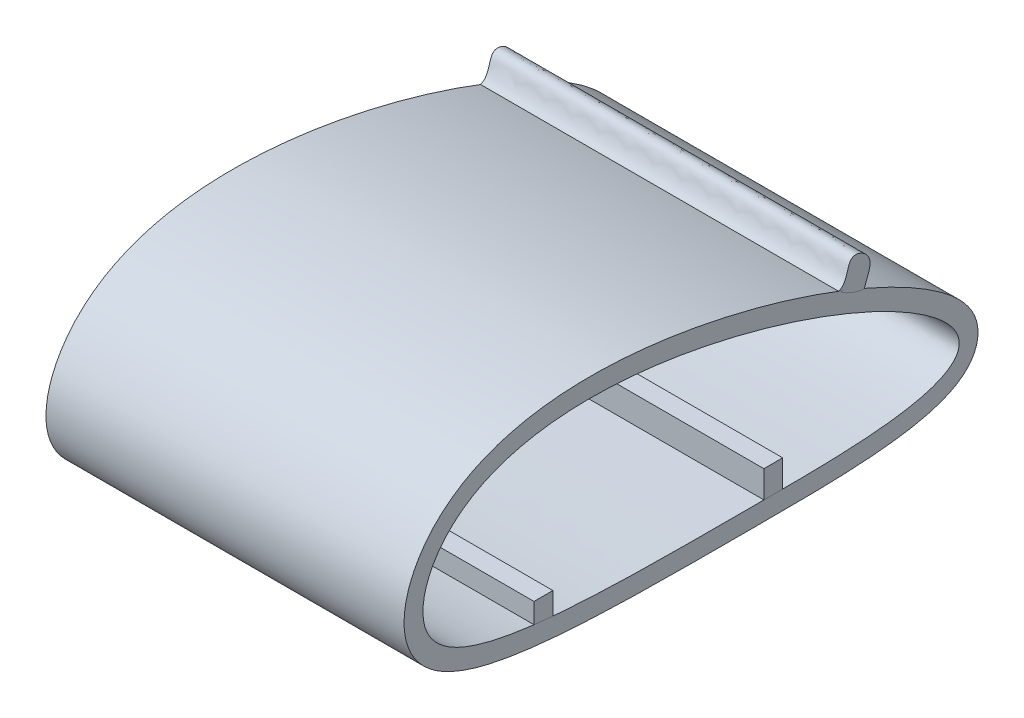
ISO-10303-21;
HEADER;
FILE_DESCRIPTION(('STEP AP214'),'2;1');
FILE_NAME('part.step','',(''),(''),'','','');
FILE_SCHEMA(('AUTOMOTIVE_DESIGN { 1 0 10303 214 1 1 1 1 }'));
ENDSEC;
DATA;
#1=APPLICATION_CONTEXT('core data for automotive mechanical design processes');
#2=APPLICATION_PROTOCOL_DEFINITION('international standard','automotive_design',2000,#1);
#3=PRODUCT_CONTEXT('',#1,'mechanical');
#4=PRODUCT('Part','Part','',(#3));
#5=PRODUCT_RELATED_PRODUCT_CATEGORY('part','',(#4));
#6=PRODUCT_DEFINITION_FORMATION('','',#4);
#7=PRODUCT_DEFINITION_CONTEXT('part definition',#1,'design');
#8=PRODUCT_DEFINITION('design','',#6,#7);
#9=PRODUCT_DEFINITION_SHAPE('','',#8);
#10=(LENGTH_UNIT() NAMED_UNIT(*) SI_UNIT(.MILLI.,.METRE.));
#11=(NAMED_UNIT(*) PLANE_ANGLE_UNIT() SI_UNIT($,.RADIAN.));
#12=(NAMED_UNIT(*) SI_UNIT($,.STERADIAN.) SOLID_ANGLE_UNIT());
#13=UNCERTAINTY_MEASURE_WITH_UNIT(LENGTH_MEASURE(1.E-05),#10,'distance_accuracy_value','');
#14=(GEOMETRIC_REPRESENTATION_CONTEXT(3) GLOBAL_UNCERTAINTY_ASSIGNED_CONTEXT((#13)) GLOBAL_UNIT_ASSIGNED_CONTEXT((#10,
#11,#12)) REPRESENTATION_CONTEXT('',''));
#15=CARTESIAN_POINT('',(0.,0.,0.));
#16=DIRECTION('',(0.,0.,1.));
#17=DIRECTION('',(1.,0.,0.));
#18=AXIS2_PLACEMENT_3D('',#15,#16,#17);
#19=CARTESIAN_POINT('',(0.,38.0482697428457,-22.7803230976267));
#20=CARTESIAN_POINT('',(0.,36.9546355091509,-24.1162425999965));
#21=CARTESIAN_POINT('',(0.,35.9717595566556,-25.6799088880573));
#22=CARTESIAN_POINT('',(0.,35.1229121431369,-28.3604796675899));
#23=CARTESIAN_POINT('',(0.,35.2827771145835,-29.6059542996546));
#24=B_SPLINE_CURVE_WITH_KNOTS('',4,(#19,#20,#21,#22,#23),.UNSPECIFIED.,.F.,.F.,(5,5),(0.,1.),.UNSPECIFIED.);
#25=DIRECTION('',(1.,0.,0.));
#26=VECTOR('',#25,1.);
#27=SURFACE_OF_LINEAR_EXTRUSION('',#24,#26);
#28=CARTESIAN_POINT('',(95.,38.0482697428457,-22.7803230976267));
#29=CARTESIAN_POINT('',(95.,36.9546355091509,-24.1162425999965));
#30=CARTESIAN_POINT('',(95.,35.9717595566556,-25.6799088880573));
#31=CARTESIAN_POINT('',(95.,35.1229121431369,-28.3604796675899));
#32=CARTESIAN_POINT('',(95.,35.2827771145835,-29.6059542996546));
#33=B_SPLINE_CURVE_WITH_KNOTS('',4,(#28,#29,#30,#31,#32),.UNSPECIFIED.,.F.,.F.,(5,5),(0.,1.),.UNSPECIFIED.);
#34=CARTESIAN_POINT('',(95.,38.0482697428457,-22.7803230976267));
#35=VERTEX_POINT('',#34);
#36=CARTESIAN_POINT('',(95.,35.2827771145835,-29.6059542996546));
#37=VERTEX_POINT('',#36);
#38=EDGE_CURVE('E76',#35,#37,#33,.T.);
#39=ORIENTED_EDGE('',*,*,#38,.F.);
#40=DIRECTION('',(1.,0.,0.));
#41=VECTOR('',#40,1.);
#42=CARTESIAN_POINT('',(0.,38.0482697428457,-22.7803230976267));
#43=LINE('',#42,#41);
#44=CARTESIAN_POINT('',(0.,38.0482697428457,-22.7803230976267));
#45=VERTEX_POINT('',#44);
#46=EDGE_CURVE('E12',#45,#35,#43,.T.);
#47=ORIENTED_EDGE('',*,*,#46,.F.);
#48=CARTESIAN_POINT('',(0.,35.2827771145835,-29.6059542996546));
#49=VERTEX_POINT('',#48);
#50=EDGE_CURVE('E80',#45,#49,#24,.T.);
#51=ORIENTED_EDGE('',*,*,#50,.T.);
#52=DIRECTION('',(1.,0.,0.));
#53=VECTOR('',#52,1.);
#54=CARTESIAN_POINT('',(0.,35.2827771145835,-29.6059542996546));
#55=LINE('',#54,#53);
#56=EDGE_CURVE('E50',#49,#37,#55,.T.);
#57=ORIENTED_EDGE('',*,*,#56,.T.);
#58=EDGE_LOOP('',(#39,#47,#51,#57));
#59=FACE_BOUND('',#58,.T.);
#60=ADVANCED_FACE('F46',(#59),#27,.T.);
#61=CARTESIAN_POINT('',(0.,35.2827771145835,-29.6059542996546));
#62=CARTESIAN_POINT('',(0.,38.9961838760519,-30.9938729019657));
#63=CARTESIAN_POINT('',(0.,40.4102287169724,-31.7693168469867));
#64=CARTESIAN_POINT('',(0.,42.0675500896643,-32.0125933787579));
#65=CARTESIAN_POINT('',(0.,43.4815949305848,-30.6593676707802));
#66=CARTESIAN_POINT('',(0.,44.6219536732627,-28.8195888992599));
#67=CARTESIAN_POINT('',(0.,45.534240667405,-26.6605096797898));
#68=CARTESIAN_POINT('',(0.,45.1085067368053,-24.9119596076837));
#69=CARTESIAN_POINT('',(0.,43.8921240779489,-25.565765286819));
#70=CARTESIAN_POINT('',(0.,42.0523453064286,-25.565765286819));
#71=CARTESIAN_POINT('',(0.,40.3190000175582,-25.0944170065122));
#72=CARTESIAN_POINT('',(0.,39.1634364916446,-24.5014304603197));
#73=CARTESIAN_POINT('',(0.,38.4031973298594,-23.9388534805986));
#74=CARTESIAN_POINT('',(0.,38.0482697428457,-22.7803230976267));
#75=B_SPLINE_CURVE_WITH_KNOTS('',13,(#61,#62,#63,#64,#65,#66,#67,#68,#69,#70,#71,#72,#73,#74),
.UNSPECIFIED.,.F.,.F.,(14,14),(0.,1.),.UNSPECIFIED.);
#76=DIRECTION('',(1.,0.,0.));
#77=VECTOR('',#76,1.);
#78=SURFACE_OF_LINEAR_EXTRUSION('',#75,#77);
#79=CARTESIAN_POINT('',(95.,35.2827771145835,-29.6059542996546));
#80=CARTESIAN_POINT('',(95.,38.9961838760519,-30.9938729019657));
#81=CARTESIAN_POINT('',(95.,40.4102287169724,-31.7693168469867));
#82=CARTESIAN_POINT('',(95.,42.0675500896643,-32.0125933787579));
#83=CARTESIAN_POINT('',(95.,43.4815949305848,-30.6593676707802));
#84=CARTESIAN_POINT('',(95.,44.6219536732627,-28.8195888992599));
#85=CARTESIAN_POINT('',(95.,45.534240667405,-26.6605096797898));
#86=CARTESIAN_POINT('',(95.,45.1085067368053,-24.9119596076837));
#87=CARTESIAN_POINT('',(95.,43.8921240779489,-25.565765286819));
#88=CARTESIAN_POINT('',(95.,42.0523453064286,-25.565765286819));
#89=CARTESIAN_POINT('',(95.,40.3190000175582,-25.0944170065122));
#90=CARTESIAN_POINT('',(95.,39.1634364916446,-24.5014304603197));
#91=CARTESIAN_POINT('',(95.,38.4031973298594,-23.9388534805986));
#92=CARTESIAN_POINT('',(95.,38.0482697428457,-22.7803230976267));
#93=B_SPLINE_CURVE_WITH_KNOTS('',13,(#79,#80,#81,#82,#83,#84,#85,#86,#87,#88,#89,#90,#91,#92),
.UNSPECIFIED.,.F.,.F.,(14,14),(0.,1.),.UNSPECIFIED.);
#94=EDGE_CURVE('E73',#37,#35,#93,.T.);
#95=ORIENTED_EDGE('',*,*,#94,.F.);
#96=ORIENTED_EDGE('',*,*,#56,.F.);
#97=EDGE_CURVE('E75',#49,#45,#75,.T.);
#98=ORIENTED_EDGE('',*,*,#97,.T.);
#99=ORIENTED_EDGE('',*,*,#46,.T.);
#100=EDGE_LOOP('',(#95,#96,#98,#99));
#101=FACE_BOUND('',#100,.T.);
#102=ADVANCED_FACE('F71',(#101),#78,.T.);
#103=CARTESIAN_POINT('',(0.,36.0919871754071,-26.0232887372482));
#104=DIRECTION('',(1.,0.,0.));
#105=DIRECTION('',(0.,0.,-1.));
#106=AXIS2_PLACEMENT_3D('',#103,#104,#105);
#107=PLANE('',#106);
#108=ORIENTED_EDGE('',*,*,#50,.F.);
#109=ORIENTED_EDGE('',*,*,#97,.F.);
#110=EDGE_LOOP('',(#108,#109));
#111=FACE_BOUND('',#110,.T.);
#112=ADVANCED_FACE('F104',(#111),#107,.F.);
#113=CARTESIAN_POINT('',(95.,36.0919871754071,-26.0232887372482));
#114=DIRECTION('',(1.,0.,0.));
#115=DIRECTION('',(0.,0.,-1.));
#116=AXIS2_PLACEMENT_3D('',#113,#114,#115);
#117=PLANE('',#116);
#118=ORIENTED_EDGE('',*,*,#38,.T.);
#119=ORIENTED_EDGE('',*,*,#94,.T.);
#120=EDGE_LOOP('',(#118,#119));
#121=FACE_BOUND('',#120,.T.);
#122=ADVANCED_FACE('F79',(#121),#117,.T.);
#123=CLOSED_SHELL('',(#60,#102,#112,#122));
#124=MANIFOLD_SOLID_BREP('B2',#123);
#125=CARTESIAN_POINT('',(0.,-6.28236919455739E-05,-2.96498298416057));
#126=DIRECTION('',(0.,-0.999998722552505,-0.00159840337801903));
#127=DIRECTION('',(0.,0.00159840337801903,-0.999998722552505));
#128=AXIS2_PLACEMENT_3D('',#125,#126,#127);
#129=PLANE('',#128);
#130=DIRECTION('',(0.,0.00159840337801903,-0.999998722552505));
#131=VECTOR('',#130,1.);
#132=CARTESIAN_POINT('',(95.,-6.28236919455739E-05,-2.96498298416057));
#133=LINE('',#132,#131);
#134=CARTESIAN_POINT('',(95.,-6.28236919455739E-05,-2.96498298416057));
#135=VERTEX_POINT('',#134);
#136=CARTESIAN_POINT('',(95.,0.00790631647110169,-7.95066437878173));
#137=VERTEX_POINT('',#136);
#138=EDGE_CURVE('E214',#135,#137,#133,.T.);
#139=ORIENTED_EDGE('',*,*,#138,.F.);
#140=DIRECTION('',(1.,0.,0.));
#141=VECTOR('',#140,1.);
#142=CARTESIAN_POINT('',(0.,-6.28236919455739E-05,-2.96498298416057));
#143=LINE('',#142,#141);
#144=CARTESIAN_POINT('',(0.,-6.28236919455739E-05,-2.96498298416057));
#145=VERTEX_POINT('',#144);
#146=EDGE_CURVE('E44',#145,#135,#143,.T.);
#147=ORIENTED_EDGE('',*,*,#146,.F.);
#148=DIRECTION('',(0.,0.00159840337801903,-0.999998722552505));
#149=VECTOR('',#148,1.);
#150=CARTESIAN_POINT('',(0.,-6.28236919455739E-05,-2.96498298416057));
#151=LINE('',#150,#149);
#152=CARTESIAN_POINT('',(0.,0.00790631647110169,-7.95066437878173));
#153=VERTEX_POINT('',#152);
#154=EDGE_CURVE('E208',#145,#153,#151,.T.);
#155=ORIENTED_EDGE('',*,*,#154,.T.);
#156=DIRECTION('',(1.,0.,0.));
#157=VECTOR('',#156,1.);
#158=CARTESIAN_POINT('',(0.,0.00790631647110169,-7.95066437878173));
#159=LINE('',#158,#157);
#160=EDGE_CURVE('E153',#153,#137,#159,.T.);
#161=ORIENTED_EDGE('',*,*,#160,.T.);
#162=EDGE_LOOP('',(#139,#147,#155,#161));
#163=FACE_BOUND('',#162,.T.);
#164=ADVANCED_FACE('F150',(#163),#129,.T.);
#165=CARTESIAN_POINT('',(0.,-6.28236919455739E-05,-2.96498298416057));
#166=DIRECTION('',(0.,0.,1.));
#167=DIRECTION('',(1.,0.,0.));
#168=AXIS2_PLACEMENT_3D('',#165,#166,#167);
#169=PLANE('',#168);
#170=DIRECTION('',(0.,-1.,0.));
#171=VECTOR('',#170,1.);
#172=CARTESIAN_POINT('',(95.,-6.28236919455739E-05,-2.96498298416057));
#173=LINE('',#172,#171);
#174=CARTESIAN_POINT('',(95.,7.18665240463453,-2.96498298416057));
#175=VERTEX_POINT('',#174);
#176=EDGE_CURVE('E210',#175,#135,#173,.T.);
#177=ORIENTED_EDGE('',*,*,#176,.F.);
#178=DIRECTION('',(1.,0.,0.));
#179=VECTOR('',#178,1.);
#180=CARTESIAN_POINT('',(0.,7.18665240463453,-2.96498298416057));
#181=LINE('',#180,#179);
#182=CARTESIAN_POINT('',(0.,7.18665240463453,-2.96498298416057));
#183=VERTEX_POINT('',#182);
#184=EDGE_CURVE('E159',#183,#175,#181,.T.);
#185=ORIENTED_EDGE('',*,*,#184,.F.);
#186=DIRECTION('',(0.,-1.,0.));
#187=VECTOR('',#186,1.);
#188=CARTESIAN_POINT('',(0.,-6.28236919455739E-05,-2.96498298416057));
#189=LINE('',#188,#187);
#190=EDGE_CURVE('E205',#183,#145,#189,.T.);
#191=ORIENTED_EDGE('',*,*,#190,.T.);
#192=ORIENTED_EDGE('',*,*,#146,.T.);
#193=EDGE_LOOP('',(#177,#185,#191,#192));
#194=FACE_BOUND('',#193,.T.);
#195=ADVANCED_FACE('F224',(#194),#169,.T.);
#196=CARTESIAN_POINT('',(0.,7.18665240463453,-2.96498298416057));
#197=DIRECTION('',(0.,1.,0.));
#198=DIRECTION('',(0.,0.,1.));
#199=AXIS2_PLACEMENT_3D('',#196,#197,#198);
#200=PLANE('',#199);
#201=DIRECTION('',(0.,0.,1.));
#202=VECTOR('',#201,1.);
#203=CARTESIAN_POINT('',(95.,7.18665240463453,-2.96498298416057));
#204=LINE('',#203,#202);
#205=CARTESIAN_POINT('',(95.,7.18665240463453,-7.95066437878173));
#206=VERTEX_POINT('',#205);
#207=EDGE_CURVE('E200',#206,#175,#204,.T.);
#208=ORIENTED_EDGE('',*,*,#207,.F.);
#209=DIRECTION('',(1.,0.,0.));
#210=VECTOR('',#209,1.);
#211=CARTESIAN_POINT('',(0.,7.18665240463453,-7.95066437878173));
#212=LINE('',#211,#210);
#213=CARTESIAN_POINT('',(0.,7.18665240463453,-7.95066437878173));
#214=VERTEX_POINT('',#213);
#215=EDGE_CURVE('E195',#214,#206,#212,.T.);
#216=ORIENTED_EDGE('',*,*,#215,.F.);
#217=DIRECTION('',(0.,0.,1.));
#218=VECTOR('',#217,1.);
#219=CARTESIAN_POINT('',(0.,7.18665240463453,-2.96498298416057));
#220=LINE('',#219,#218);
#221=EDGE_CURVE('E198',#214,#183,#220,.T.);
#222=ORIENTED_EDGE('',*,*,#221,.T.);
#223=ORIENTED_EDGE('',*,*,#184,.T.);
#224=EDGE_LOOP('',(#208,#216,#222,#223));
#225=FACE_BOUND('',#224,.T.);
#226=ADVANCED_FACE('F197',(#225),#200,.T.);
#227=CARTESIAN_POINT('',(0.,7.18665240463453,-7.95066437878173));
#228=DIRECTION('',(0.,0.,-1.));
#229=DIRECTION('',(-1.,0.,0.));
#230=AXIS2_PLACEMENT_3D('',#227,#228,#229);
#231=PLANE('',#230);
#232=DIRECTION('',(0.,1.,0.));
#233=VECTOR('',#232,1.);
#234=CARTESIAN_POINT('',(95.,7.18665240463453,-7.95066437878173));
#235=LINE('',#234,#233);
#236=EDGE_CURVE('E217',#137,#206,#235,.T.);
#237=ORIENTED_EDGE('',*,*,#236,.F.);
#238=ORIENTED_EDGE('',*,*,#160,.F.);
#239=DIRECTION('',(0.,1.,0.));
#240=VECTOR('',#239,1.);
#241=CARTESIAN_POINT('',(0.,7.18665240463453,-7.95066437878173));
#242=LINE('',#241,#240);
#243=EDGE_CURVE('E204',#153,#214,#242,.T.);
#244=ORIENTED_EDGE('',*,*,#243,.T.);
#245=ORIENTED_EDGE('',*,*,#215,.T.);
#246=EDGE_LOOP('',(#237,#238,#244,#245));
#247=FACE_BOUND('',#246,.T.);
#248=ADVANCED_FACE('F207',(#247),#231,.T.);
#249=CARTESIAN_POINT('',(0.,0.,0.));
#250=DIRECTION('',(-1.,0.,0.));
#251=DIRECTION('',(0.,0.,1.));
#252=AXIS2_PLACEMENT_3D('',#249,#250,#251);
#253=PLANE('',#252);
#254=ORIENTED_EDGE('',*,*,#154,.F.);
#255=ORIENTED_EDGE('',*,*,#190,.F.);
#256=ORIENTED_EDGE('',*,*,#221,.F.);
#257=ORIENTED_EDGE('',*,*,#243,.F.);
#258=EDGE_LOOP('',(#254,#255,#256,#257));
#259=FACE_BOUND('',#258,.T.);
#260=ADVANCED_FACE('F203',(#259),#253,.T.);
#261=CARTESIAN_POINT('',(95.,0.,0.));
#262=DIRECTION('',(-1.,0.,0.));
#263=DIRECTION('',(0.,0.,1.));
#264=AXIS2_PLACEMENT_3D('',#261,#262,#263);
#265=PLANE('',#264);
#266=ORIENTED_EDGE('',*,*,#138,.T.);
#267=ORIENTED_EDGE('',*,*,#236,.T.);
#268=ORIENTED_EDGE('',*,*,#207,.T.);
#269=ORIENTED_EDGE('',*,*,#176,.T.);
#270=EDGE_LOOP('',(#266,#267,#268,#269));
#271=FACE_BOUND('',#270,.T.);
#272=ADVANCED_FACE('F223',(#271),#265,.F.);
#273=CLOSED_SHELL('',(#164,#195,#226,#248,#260,#272));
#274=MANIFOLD_SOLID_BREP('B6',#273);
#275=CARTESIAN_POINT('',(0.,1.82556742800504,58.025229647874));
#276=DIRECTION('',(0.,-0.994656039654793,0.103244190045939));
#277=DIRECTION('',(0.,-0.103244190045939,-0.994656039654794));
#278=AXIS2_PLACEMENT_3D('',#275,#276,#277);
#279=PLANE('',#278);
#280=DIRECTION('',(0.,-0.103244190045939,-0.994656039654793));
#281=VECTOR('',#280,1.);
#282=CARTESIAN_POINT('',(95.,1.82556742800504,58.025229647874));
#283=LINE('',#282,#281);
#284=CARTESIAN_POINT('',(95.,1.82556742800504,58.025229647874));
#285=VERTEX_POINT('',#284);
#286=CARTESIAN_POINT('',(95.,1.30544627766232,53.0143748645647));
#287=VERTEX_POINT('',#286);
#288=EDGE_CURVE('E345',#285,#287,#283,.T.);
#289=ORIENTED_EDGE('',*,*,#288,.F.);
#290=DIRECTION('',(1.,0.,0.));
#291=VECTOR('',#290,1.);
#292=CARTESIAN_POINT('',(0.,1.82556742800504,58.025229647874));
#293=LINE('',#292,#291);
#294=CARTESIAN_POINT('',(0.,1.82556742800504,58.025229647874));
#295=VERTEX_POINT('',#294);
#296=EDGE_CURVE('E148',#295,#285,#293,.T.);
#297=ORIENTED_EDGE('',*,*,#296,.F.);
#298=DIRECTION('',(0.,-0.103244190045939,-0.994656039654793));
#299=VECTOR('',#298,1.);
#300=CARTESIAN_POINT('',(0.,1.82556742800504,58.025229647874));
#301=LINE('',#300,#299);
#302=CARTESIAN_POINT('',(0.,1.30544627766232,53.0143748645647));
#303=VERTEX_POINT('',#302);
#304=EDGE_CURVE('E339',#295,#303,#301,.T.);
#305=ORIENTED_EDGE('',*,*,#304,.T.);
#306=DIRECTION('',(1.,0.,0.));
#307=VECTOR('',#306,1.);
#308=CARTESIAN_POINT('',(0.,1.30544627766232,53.0143748645647));
#309=LINE('',#308,#307);
#310=EDGE_CURVE('E284',#303,#287,#309,.T.);
#311=ORIENTED_EDGE('',*,*,#310,.T.);
#312=EDGE_LOOP('',(#289,#297,#305,#311));
#313=FACE_BOUND('',#312,.T.);
#314=ADVANCED_FACE('F281',(#313),#279,.T.);
#315=CARTESIAN_POINT('',(0.,7.18665240463453,58.0252296478739));
#316=DIRECTION('',(0.,0.,1.));
#317=DIRECTION('',(0.,-1.,0.));
#318=AXIS2_PLACEMENT_3D('',#315,#316,#317);
#319=PLANE('',#318);
#320=DIRECTION('',(0.,-1.,0.));
#321=VECTOR('',#320,1.);
#322=CARTESIAN_POINT('',(95.,7.18665240463453,58.0252296478739));
#323=LINE('',#322,#321);
#324=CARTESIAN_POINT('',(95.,7.18665240463453,58.0252296478739));
#325=VERTEX_POINT('',#324);
#326=EDGE_CURVE('E341',#325,#285,#323,.T.);
#327=ORIENTED_EDGE('',*,*,#326,.F.);
#328=DIRECTION('',(1.,0.,0.));
#329=VECTOR('',#328,1.);
#330=CARTESIAN_POINT('',(0.,7.18665240463453,58.0252296478739));
#331=LINE('',#330,#329);
#332=CARTESIAN_POINT('',(0.,7.18665240463453,58.0252296478739));
#333=VERTEX_POINT('',#332);
#334=EDGE_CURVE('E290',#333,#325,#331,.T.);
#335=ORIENTED_EDGE('',*,*,#334,.F.);
#336=DIRECTION('',(0.,-1.,0.));
#337=VECTOR('',#336,1.);
#338=CARTESIAN_POINT('',(0.,7.18665240463453,58.0252296478739));
#339=LINE('',#338,#337);
#340=EDGE_CURVE('E336',#333,#295,#339,.T.);
#341=ORIENTED_EDGE('',*,*,#340,.T.);
#342=ORIENTED_EDGE('',*,*,#296,.T.);
#343=EDGE_LOOP('',(#327,#335,#341,#342));
#344=FACE_BOUND('',#343,.T.);
#345=ADVANCED_FACE('F355',(#344),#319,.T.);
#346=CARTESIAN_POINT('',(0.,7.18665240463453,53.0143748645647));
#347=DIRECTION('',(0.,1.,0.));
#348=DIRECTION('',(0.,0.,1.));
#349=AXIS2_PLACEMENT_3D('',#346,#347,#348);
#350=PLANE('',#349);
#351=DIRECTION('',(0.,0.,1.));
#352=VECTOR('',#351,1.);
#353=CARTESIAN_POINT('',(95.,7.18665240463453,53.0143748645647));
#354=LINE('',#353,#352);
#355=CARTESIAN_POINT('',(95.,7.18665240463453,53.0143748645647));
#356=VERTEX_POINT('',#355);
#357=EDGE_CURVE('E331',#356,#325,#354,.T.);
#358=ORIENTED_EDGE('',*,*,#357,.F.);
#359=DIRECTION('',(1.,0.,0.));
#360=VECTOR('',#359,1.);
#361=CARTESIAN_POINT('',(0.,7.18665240463453,53.0143748645647));
#362=LINE('',#361,#360);
#363=CARTESIAN_POINT('',(0.,7.18665240463453,53.0143748645647));
#364=VERTEX_POINT('',#363);
#365=EDGE_CURVE('E326',#364,#356,#362,.T.);
#366=ORIENTED_EDGE('',*,*,#365,.F.);
#367=DIRECTION('',(0.,0.,1.));
#368=VECTOR('',#367,1.);
#369=CARTESIAN_POINT('',(0.,7.18665240463453,53.0143748645647));
#370=LINE('',#369,#368);
#371=EDGE_CURVE('E329',#364,#333,#370,.T.);
#372=ORIENTED_EDGE('',*,*,#371,.T.);
#373=ORIENTED_EDGE('',*,*,#334,.T.);
#374=EDGE_LOOP('',(#358,#366,#372,#373));
#375=FACE_BOUND('',#374,.T.);
#376=ADVANCED_FACE('F328',(#375),#350,.T.);
#377=CARTESIAN_POINT('',(0.,1.30544627766232,53.0143748645647));
#378=DIRECTION('',(0.,0.,-1.));
#379=DIRECTION('',(-1.,0.,0.));
#380=AXIS2_PLACEMENT_3D('',#377,#378,#379);
#381=PLANE('',#380);
#382=DIRECTION('',(0.,1.,0.));
#383=VECTOR('',#382,1.);
#384=CARTESIAN_POINT('',(95.,1.30544627766232,53.0143748645647));
#385=LINE('',#384,#383);
#386=EDGE_CURVE('E348',#287,#356,#385,.T.);
#387=ORIENTED_EDGE('',*,*,#386,.F.);
#388=ORIENTED_EDGE('',*,*,#310,.F.);
#389=DIRECTION('',(0.,1.,0.));
#390=VECTOR('',#389,1.);
#391=CARTESIAN_POINT('',(0.,1.30544627766232,53.0143748645647));
#392=LINE('',#391,#390);
#393=EDGE_CURVE('E335',#303,#364,#392,.T.);
#394=ORIENTED_EDGE('',*,*,#393,.T.);
#395=ORIENTED_EDGE('',*,*,#365,.T.);
#396=EDGE_LOOP('',(#387,#388,#394,#395));
#397=FACE_BOUND('',#396,.T.);
#398=ADVANCED_FACE('F338',(#397),#381,.T.);
#399=CARTESIAN_POINT('',(0.,0.,0.));
#400=DIRECTION('',(1.,0.,0.));
#401=DIRECTION('',(0.,0.,-1.));
#402=AXIS2_PLACEMENT_3D('',#399,#400,#401);
#403=PLANE('',#402);
#404=ORIENTED_EDGE('',*,*,#304,.F.);
#405=ORIENTED_EDGE('',*,*,#340,.F.);
#406=ORIENTED_EDGE('',*,*,#371,.F.);
#407=ORIENTED_EDGE('',*,*,#393,.F.);
#408=EDGE_LOOP('',(#404,#405,#406,#407));
#409=FACE_BOUND('',#408,.T.);
#410=ADVANCED_FACE('F334',(#409),#403,.F.);
#411=CARTESIAN_POINT('',(95.,0.,0.));
#412=DIRECTION('',(1.,0.,0.));
#413=DIRECTION('',(0.,0.,-1.));
#414=AXIS2_PLACEMENT_3D('',#411,#412,#413);
#415=PLANE('',#414);
#416=ORIENTED_EDGE('',*,*,#288,.T.);
#417=ORIENTED_EDGE('',*,*,#386,.T.);
#418=ORIENTED_EDGE('',*,*,#357,.T.);
#419=ORIENTED_EDGE('',*,*,#326,.T.);
#420=EDGE_LOOP('',(#416,#417,#418,#419));
#421=FACE_BOUND('',#420,.T.);
#422=ADVANCED_FACE('F354',(#421),#415,.T.);
#423=CLOSED_SHELL('',(#314,#345,#376,#398,#410,#422));
#424=MANIFOLD_SOLID_BREP('B38',#423);
#425=CARTESIAN_POINT('',(95.,49.5496227093733,61.933637732226));
#426=DIRECTION('',(-1.,0.,0.));
#427=DIRECTION('',(0.,0.,1.));
#428=AXIS2_PLACEMENT_3D('',#425,#426,#427);
#429=PLANE('',#428);
#430=CARTESIAN_POINT('',(95.,-5.,0.));
#431=CARTESIAN_POINT('',(95.,-5.00004274012654,-3.64983649267749));
#432=CARTESIAN_POINT('',(95.,-5.00504722374775,-10.9601230589846));
#433=CARTESIAN_POINT('',(95.,-4.84122784830163,-21.3807183438263));
#434=CARTESIAN_POINT('',(95.,-4.38340684459379,-30.8162384817341));
#435=CARTESIAN_POINT('',(95.,-3.55457002158814,-39.0183291034666));
#436=CARTESIAN_POINT('',(95.,-2.29966046767906,-45.8843162562741));
#437=CARTESIAN_POINT('',(95.,-0.54061104281959,-51.4483771725021));
#438=CARTESIAN_POINT('',(95.,1.53129742033775,-55.1721910561136));
#439=CARTESIAN_POINT('',(95.,3.89001542518774,-57.6037583408936));
#440=CARTESIAN_POINT('',(95.,6.10339302107875,-59.0158406015797));
#441=CARTESIAN_POINT('',(95.,8.6723996677769,-59.785333324639));
#442=CARTESIAN_POINT('',(95.,11.2763444492663,-59.801685656824));
#443=CARTESIAN_POINT('',(95.,13.6531478851539,-59.2170682930976));
#444=CARTESIAN_POINT('',(95.,16.4675994501068,-57.9023012537942));
#445=CARTESIAN_POINT('',(95.,19.491762623143,-55.5673466414546));
#446=CARTESIAN_POINT('',(95.,22.7935575808684,-51.9574567987723));
#447=CARTESIAN_POINT('',(95.,25.9359323988585,-47.6159976051294));
#448=CARTESIAN_POINT('',(95.,29.9703170380322,-40.9803567572277));
#449=CARTESIAN_POINT('',(95.,34.7191793249512,-31.355808928976));
#450=CARTESIAN_POINT('',(95.,39.7827670480141,-18.5311812304197));
#451=CARTESIAN_POINT('',(95.,44.0428344111626,-5.18410808675097));
#452=CARTESIAN_POINT('',(95.,47.3883370908126,8.0842612612669));
#453=CARTESIAN_POINT('',(95.,50.5555119122916,25.0848631907529));
#454=CARTESIAN_POINT('',(95.,52.0449322340946,44.2219316558802));
#455=CARTESIAN_POINT('',(95.,50.1095930377774,62.674800371136));
#456=CARTESIAN_POINT('',(95.,44.8144318710353,76.680693252932));
#457=CARTESIAN_POINT('',(95.,38.0345466659887,84.8059679671169));
#458=CARTESIAN_POINT('',(95.,31.7117337711971,89.219575555784));
#459=CARTESIAN_POINT('',(95.,26.6296835160205,91.4937630319484));
#460=CARTESIAN_POINT('',(95.,21.2454443086755,92.6495641644883));
#461=CARTESIAN_POINT('',(95.,15.5529508990171,92.3941083075815));
#462=CARTESIAN_POINT('',(95.,9.80382256024667,90.1061033435934));
#463=CARTESIAN_POINT('',(95.,4.85410433553908,85.4534170410032));
#464=CARTESIAN_POINT('',(95.,1.11721360151873,78.6441180957125));
#465=CARTESIAN_POINT('',(95.,-1.62575230288153,69.3831105932449));
#466=CARTESIAN_POINT('',(95.,-3.51364302181979,57.0483051151262));
#467=CARTESIAN_POINT('',(95.,-4.60957692718704,41.1927550777155));
#468=CARTESIAN_POINT('',(95.,-5.01941957271329,21.8565646322563));
#469=CARTESIAN_POINT('',(95.,-4.99991451974692,7.29967298535497));
#470=CARTESIAN_POINT('',(95.,-5.,0.));
#471=B_SPLINE_CURVE_WITH_KNOTS('',3,(#430,#431,#432,#433,#434,#435,#436,#437,#438,#439,#440,
#441,#442,#443,#444,#445,#446,#447,#448,#449,#450,#451,#452,#453,#454,#455,#456,#457,#458,#459,
#460,#461,#462,#463,#464,#465,#466,#467,#468,#469,#470),.UNSPECIFIED.,.T.,.F.,(4,1,1,1,1,1,1,1,
1,1,1,1,1,1,1,1,1,1,1,1,1,1,1,1,1,1,1,1,1,1,1,1,1,1,1,1,1,1,4),(0.,0.015625,0.03125,0.046875,
0.0625,0.078125,0.09375,0.109375,0.1171875,0.125,0.1328125,0.140625,0.1484375,0.15625,0.171875,
0.1875,0.203125,0.21875,0.25,0.28125,0.3125,0.34375,0.375,0.4375,0.5,0.5625,0.625,0.65625,
0.6875,0.71875,0.75,0.78125,0.8125,0.84375,0.875,0.90625,0.9375,0.96875,1.),.UNSPECIFIED.);
#472=CARTESIAN_POINT('',(95.,-5.,0.));
#473=VERTEX_POINT('',#472);
#474=EDGE_CURVE('E280',#473,#473,#471,.T.);
#475=ORIENTED_EDGE('',*,*,#474,.T.);
#476=EDGE_LOOP('',(#475));
#477=FACE_BOUND('',#476,.T.);
#478=CARTESIAN_POINT('',(95.,0.,0.));
#479=CARTESIAN_POINT('',(95.,0.,-63.6806312691255));
#480=CARTESIAN_POINT('',(95.,-0.80236697919754,-127.361262538251));
#481=CARTESIAN_POINT('',(95.,57.2290897605148,2.28270863296708));
#482=CARTESIAN_POINT('',(95.,53.5292948131081,24.9652152861734));
#483=CARTESIAN_POINT('',(95.,58.3317129917635,71.3747750477653));
#484=CARTESIAN_POINT('',(95.,50.3412398626272,86.0151855204238));
#485=CARTESIAN_POINT('',(95.,33.3521033034803,93.6700010395021));
#486=CARTESIAN_POINT('',(95.,19.6964707833449,74.9994891260882));
#487=CARTESIAN_POINT('',(95.,-0.802366979197571,127.361262538251));
#488=CARTESIAN_POINT('',(95.,0.,63.6806312691255));
#489=CARTESIAN_POINT('',(95.,0.,0.));
#490=B_SPLINE_CURVE_WITH_KNOTS('',11,(#478,#479,#480,#481,#482,#483,#484,#485,#486,#487,#488,
#489),.UNSPECIFIED.,.T.,.F.,(12,12),(0.,1.),.UNSPECIFIED.);
#491=CARTESIAN_POINT('',(95.,0.,0.));
#492=VERTEX_POINT('',#491);
#493=EDGE_CURVE('E418',#492,#492,#490,.T.);
#494=ORIENTED_EDGE('',*,*,#493,.F.);
#495=EDGE_LOOP('',(#494));
#496=FACE_BOUND('',#495,.T.);
#497=ADVANCED_FACE('F405',(#477,#496),#429,.F.);
#498=CARTESIAN_POINT('',(0.,49.5496227093733,61.933637732226));
#499=DIRECTION('',(-1.,0.,0.));
#500=DIRECTION('',(0.,0.,1.));
#501=AXIS2_PLACEMENT_3D('',#498,#499,#500);
#502=PLANE('',#501);
#503=CARTESIAN_POINT('',(0.,-5.,0.));
#504=CARTESIAN_POINT('',(0.,-5.00004274012654,-3.64983649267749));
#505=CARTESIAN_POINT('',(0.,-5.00504722374775,-10.9601230589846));
#506=CARTESIAN_POINT('',(0.,-4.84122784830163,-21.3807183438263));
#507=CARTESIAN_POINT('',(0.,-4.38340684459379,-30.8162384817341));
#508=CARTESIAN_POINT('',(0.,-3.55457002158814,-39.0183291034666));
#509=CARTESIAN_POINT('',(0.,-2.29966046767906,-45.8843162562741));
#510=CARTESIAN_POINT('',(0.,-0.54061104281959,-51.4483771725021));
#511=CARTESIAN_POINT('',(0.,1.53129742033775,-55.1721910561136));
#512=CARTESIAN_POINT('',(0.,3.89001542518774,-57.6037583408936));
#513=CARTESIAN_POINT('',(0.,6.10339302107875,-59.0158406015797));
#514=CARTESIAN_POINT('',(0.,8.6723996677769,-59.785333324639));
#515=CARTESIAN_POINT('',(0.,11.2763444492663,-59.801685656824));
#516=CARTESIAN_POINT('',(0.,13.6531478851539,-59.2170682930976));
#517=CARTESIAN_POINT('',(0.,16.4675994501068,-57.9023012537942));
#518=CARTESIAN_POINT('',(0.,19.491762623143,-55.5673466414546));
#519=CARTESIAN_POINT('',(0.,22.7935575808684,-51.9574567987723));
#520=CARTESIAN_POINT('',(0.,25.9359323988585,-47.6159976051294));
#521=CARTESIAN_POINT('',(0.,29.9703170380322,-40.9803567572277));
#522=CARTESIAN_POINT('',(0.,34.7191793249512,-31.355808928976));
#523=CARTESIAN_POINT('',(0.,39.7827670480141,-18.5311812304197));
#524=CARTESIAN_POINT('',(0.,44.0428344111626,-5.18410808675097));
#525=CARTESIAN_POINT('',(0.,47.3883370908126,8.0842612612669));
#526=CARTESIAN_POINT('',(0.,50.5555119122916,25.0848631907529));
#527=CARTESIAN_POINT('',(0.,52.0449322340946,44.2219316558802));
#528=CARTESIAN_POINT('',(0.,50.1095930377774,62.674800371136));
#529=CARTESIAN_POINT('',(0.,44.8144318710353,76.680693252932));
#530=CARTESIAN_POINT('',(0.,38.0345466659887,84.8059679671169));
#531=CARTESIAN_POINT('',(0.,31.7117337711971,89.219575555784));
#532=CARTESIAN_POINT('',(0.,26.6296835160205,91.4937630319484));
#533=CARTESIAN_POINT('',(0.,21.2454443086755,92.6495641644883));
#534=CARTESIAN_POINT('',(0.,15.5529508990171,92.3941083075815));
#535=CARTESIAN_POINT('',(0.,9.80382256024667,90.1061033435934));
#536=CARTESIAN_POINT('',(0.,4.85410433553908,85.4534170410032));
#537=CARTESIAN_POINT('',(0.,1.11721360151873,78.6441180957125));
#538=CARTESIAN_POINT('',(0.,-1.62575230288153,69.3831105932449));
#539=CARTESIAN_POINT('',(0.,-3.51364302181979,57.0483051151262));
#540=CARTESIAN_POINT('',(0.,-4.60957692718704,41.1927550777155));
#541=CARTESIAN_POINT('',(0.,-5.01941957271329,21.8565646322563));
#542=CARTESIAN_POINT('',(0.,-4.99991451974692,7.29967298535497));
#543=CARTESIAN_POINT('',(0.,-5.,0.));
#544=B_SPLINE_CURVE_WITH_KNOTS('',3,(#503,#504,#505,#506,#507,#508,#509,#510,#511,#512,#513,
#514,#515,#516,#517,#518,#519,#520,#521,#522,#523,#524,#525,#526,#527,#528,#529,#530,#531,#532,
#533,#534,#535,#536,#537,#538,#539,#540,#541,#542,#543),.UNSPECIFIED.,.T.,.F.,(4,1,1,1,1,1,1,1,
1,1,1,1,1,1,1,1,1,1,1,1,1,1,1,1,1,1,1,1,1,1,1,1,1,1,1,1,1,1,4),(0.,0.015625,0.03125,0.046875,
0.0625,0.078125,0.09375,0.109375,0.1171875,0.125,0.1328125,0.140625,0.1484375,0.15625,0.171875,
0.1875,0.203125,0.21875,0.25,0.28125,0.3125,0.34375,0.375,0.4375,0.5,0.5625,0.625,0.65625,
0.6875,0.71875,0.75,0.78125,0.8125,0.84375,0.875,0.90625,0.9375,0.96875,1.),.UNSPECIFIED.);
#545=CARTESIAN_POINT('',(0.,-5.,0.));
#546=VERTEX_POINT('',#545);
#547=EDGE_CURVE('E410',#546,#546,#544,.T.);
#548=ORIENTED_EDGE('',*,*,#547,.F.);
#549=EDGE_LOOP('',(#548));
#550=FACE_BOUND('',#549,.T.);
#551=CARTESIAN_POINT('',(0.,0.,0.));
#552=CARTESIAN_POINT('',(0.,0.,-63.6806312691255));
#553=CARTESIAN_POINT('',(0.,-0.80236697919754,-127.361262538251));
#554=CARTESIAN_POINT('',(0.,57.2290897605148,2.28270863296708));
#555=CARTESIAN_POINT('',(0.,53.5292948131081,24.9652152861734));
#556=CARTESIAN_POINT('',(0.,58.3317129917635,71.3747750477653));
#557=CARTESIAN_POINT('',(0.,50.3412398626272,86.0151855204238));
#558=CARTESIAN_POINT('',(0.,33.3521033034803,93.6700010395021));
#559=CARTESIAN_POINT('',(0.,19.6964707833449,74.9994891260882));
#560=CARTESIAN_POINT('',(0.,-0.802366979197571,127.361262538251));
#561=CARTESIAN_POINT('',(0.,0.,63.6806312691255));
#562=CARTESIAN_POINT('',(0.,0.,0.));
#563=B_SPLINE_CURVE_WITH_KNOTS('',11,(#551,#552,#553,#554,#555,#556,#557,#558,#559,#560,#561,
#562),.UNSPECIFIED.,.T.,.F.,(12,12),(0.,1.),.UNSPECIFIED.);
#564=CARTESIAN_POINT('',(0.,0.,0.));
#565=VERTEX_POINT('',#564);
#566=EDGE_CURVE('E423',#565,#565,#563,.T.);
#567=ORIENTED_EDGE('',*,*,#566,.T.);
#568=EDGE_LOOP('',(#567));
#569=FACE_BOUND('',#568,.T.);
#570=ADVANCED_FACE('F447',(#550,#569),#502,.T.);
#571=DIRECTION('',(-1.,0.,0.));
#572=VECTOR('',#571,1.);
#573=SURFACE_OF_LINEAR_EXTRUSION('',#471,#572);
#574=ORIENTED_EDGE('',*,*,#474,.F.);
#575=EDGE_LOOP('',(#574));
#576=FACE_BOUND('',#575,.T.);
#577=ORIENTED_EDGE('',*,*,#547,.T.);
#578=EDGE_LOOP('',(#577));
#579=FACE_BOUND('',#578,.T.);
#580=ADVANCED_FACE('F407',(#576,#579),#573,.F.);
#581=DIRECTION('',(-1.,0.,0.));
#582=VECTOR('',#581,1.);
#583=SURFACE_OF_LINEAR_EXTRUSION('',#490,#582);
#584=ORIENTED_EDGE('',*,*,#493,.T.);
#585=EDGE_LOOP('',(#584));
#586=FACE_BOUND('',#585,.T.);
#587=ORIENTED_EDGE('',*,*,#566,.F.);
#588=EDGE_LOOP('',(#587));
#589=FACE_BOUND('',#588,.T.);
#590=ADVANCED_FACE('F442',(#586,#589),#583,.T.);
#591=CLOSED_SHELL('',(#497,#570,#580,#590));
#592=MANIFOLD_SOLID_BREP('B142',#591);
#593=ADVANCED_BREP_SHAPE_REPRESENTATION('',(#18,#124,#274,#424,#592),#14);
#594=SHAPE_DEFINITION_REPRESENTATION(#9,#593);
ENDSEC;
END-ISO-10303-21;
